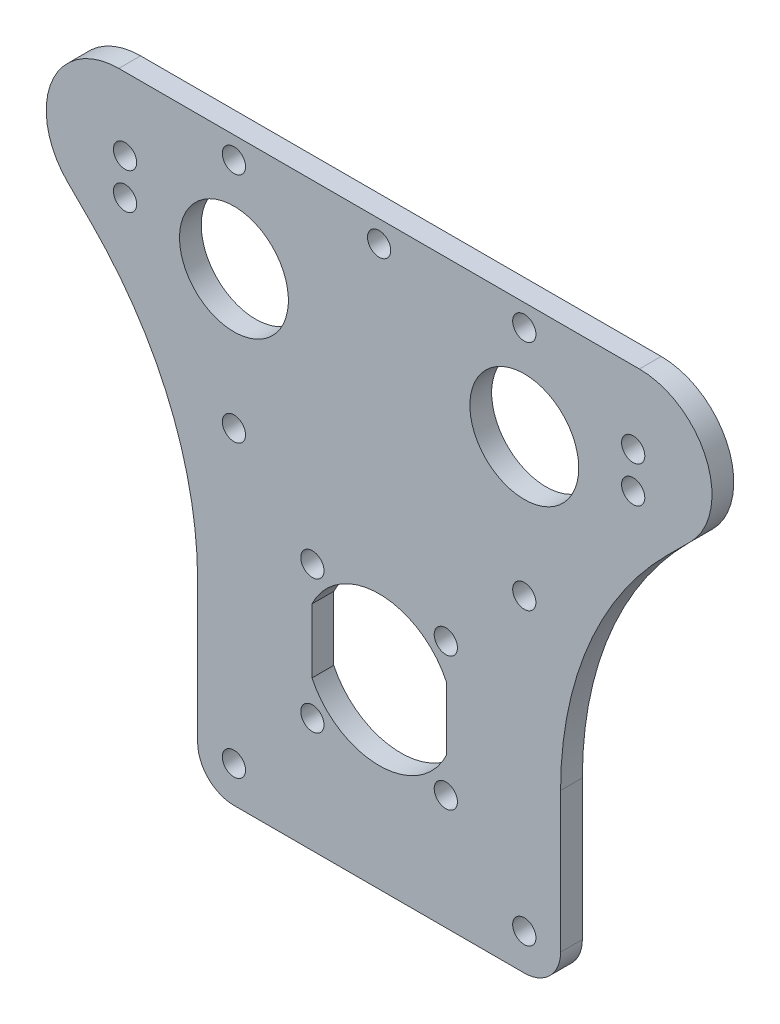
ISO-10303-21;
HEADER;
FILE_DESCRIPTION(('STEP AP214'),'2;1');
FILE_NAME('part.step','',(''),(''),'','','');
FILE_SCHEMA(('AUTOMOTIVE_DESIGN { 1 0 10303 214 1 1 1 1 }'));
ENDSEC;
DATA;
#1=APPLICATION_CONTEXT('core data for automotive mechanical design processes');
#2=APPLICATION_PROTOCOL_DEFINITION('international standard','automotive_design',2000,#1);
#3=PRODUCT_CONTEXT('',#1,'mechanical');
#4=PRODUCT('Part','Part','',(#3));
#5=PRODUCT_RELATED_PRODUCT_CATEGORY('part','',(#4));
#6=PRODUCT_DEFINITION_FORMATION('','',#4);
#7=PRODUCT_DEFINITION_CONTEXT('part definition',#1,'design');
#8=PRODUCT_DEFINITION('design','',#6,#7);
#9=PRODUCT_DEFINITION_SHAPE('','',#8);
#10=(LENGTH_UNIT() NAMED_UNIT(*) SI_UNIT(.MILLI.,.METRE.));
#11=(NAMED_UNIT(*) PLANE_ANGLE_UNIT() SI_UNIT($,.RADIAN.));
#12=(NAMED_UNIT(*) SI_UNIT($,.STERADIAN.) SOLID_ANGLE_UNIT());
#13=UNCERTAINTY_MEASURE_WITH_UNIT(LENGTH_MEASURE(1.E-05),#10,'distance_accuracy_value','');
#14=(GEOMETRIC_REPRESENTATION_CONTEXT(3) GLOBAL_UNCERTAINTY_ASSIGNED_CONTEXT((#13)) GLOBAL_UNIT_ASSIGNED_CONTEXT((#10,
#11,#12)) REPRESENTATION_CONTEXT('',''));
#15=CARTESIAN_POINT('',(0.,0.,0.));
#16=DIRECTION('',(0.,0.,1.));
#17=DIRECTION('',(1.,0.,0.));
#18=AXIS2_PLACEMENT_3D('',#15,#16,#17);
#19=CARTESIAN_POINT('',(0.,0.,3.));
#20=DIRECTION('',(0.,0.,1.));
#21=DIRECTION('',(1.,0.,0.));
#22=AXIS2_PLACEMENT_3D('',#19,#20,#21);
#23=PLANE('',#22);
#24=CARTESIAN_POINT('',(-20.,51.9999999999999,3.));
#25=DIRECTION('',(0.,0.,1.));
#26=DIRECTION('',(1.,0.,0.));
#27=AXIS2_PLACEMENT_3D('',#24,#25,#26);
#28=CIRCLE('',#27,1.6);
#29=CARTESIAN_POINT('',(-18.4,51.9999999999999,3.));
#30=VERTEX_POINT('',#29);
#31=EDGE_CURVE('E749',#30,#30,#28,.T.);
#32=ORIENTED_EDGE('',*,*,#31,.F.);
#33=EDGE_LOOP('',(#32));
#34=FACE_BOUND('',#33,.T.);
#35=CARTESIAN_POINT('',(20.,52.,3.));
#36=DIRECTION('',(0.,0.,1.));
#37=DIRECTION('',(1.,0.,0.));
#38=AXIS2_PLACEMENT_3D('',#35,#36,#37);
#39=CIRCLE('',#38,1.6);
#40=CARTESIAN_POINT('',(21.6,52.,3.));
#41=VERTEX_POINT('',#40);
#42=EDGE_CURVE('E751',#41,#41,#39,.T.);
#43=ORIENTED_EDGE('',*,*,#42,.F.);
#44=EDGE_LOOP('',(#43));
#45=FACE_BOUND('',#44,.T.);
#46=CARTESIAN_POINT('',(0.,52.,3.));
#47=DIRECTION('',(0.,0.,1.));
#48=DIRECTION('',(1.,0.,0.));
#49=AXIS2_PLACEMENT_3D('',#46,#47,#48);
#50=CIRCLE('',#49,1.6);
#51=CARTESIAN_POINT('',(1.6,52.,3.));
#52=VERTEX_POINT('',#51);
#53=EDGE_CURVE('E759',#52,#52,#50,.T.);
#54=ORIENTED_EDGE('',*,*,#53,.F.);
#55=EDGE_LOOP('',(#54));
#56=FACE_BOUND('',#55,.T.);
#57=CARTESIAN_POINT('',(35.,40.,3.));
#58=DIRECTION('',(0.,0.,-1.));
#59=DIRECTION('',(-1.,0.,0.));
#60=AXIS2_PLACEMENT_3D('',#57,#58,#59);
#61=CIRCLE('',#60,1.6);
#62=CARTESIAN_POINT('',(33.4,40.,3.));
#63=VERTEX_POINT('',#62);
#64=EDGE_CURVE('E763',#63,#63,#61,.T.);
#65=ORIENTED_EDGE('',*,*,#64,.T.);
#66=EDGE_LOOP('',(#65));
#67=FACE_BOUND('',#66,.T.);
#68=CARTESIAN_POINT('',(-35.,40.,3.));
#69=DIRECTION('',(0.,0.,-1.));
#70=DIRECTION('',(1.,0.,0.));
#71=AXIS2_PLACEMENT_3D('',#68,#69,#70);
#72=CIRCLE('',#71,1.6);
#73=CARTESIAN_POINT('',(-33.4,40.,3.));
#74=VERTEX_POINT('',#73);
#75=EDGE_CURVE('E770',#74,#74,#72,.T.);
#76=ORIENTED_EDGE('',*,*,#75,.T.);
#77=EDGE_LOOP('',(#76));
#78=FACE_BOUND('',#77,.T.);
#79=CARTESIAN_POINT('',(20.,39.,3.));
#80=DIRECTION('',(0.,0.,1.));
#81=DIRECTION('',(1.,0.,0.));
#82=AXIS2_PLACEMENT_3D('',#79,#80,#81);
#83=CIRCLE('',#82,7.5);
#84=CARTESIAN_POINT('',(27.5,39.,3.));
#85=VERTEX_POINT('',#84);
#86=EDGE_CURVE('E779',#85,#85,#83,.T.);
#87=ORIENTED_EDGE('',*,*,#86,.F.);
#88=EDGE_LOOP('',(#87));
#89=FACE_BOUND('',#88,.T.);
#90=CARTESIAN_POINT('',(-20.,39.,3.));
#91=DIRECTION('',(0.,0.,1.));
#92=DIRECTION('',(-1.,0.,0.));
#93=AXIS2_PLACEMENT_3D('',#90,#91,#92);
#94=CIRCLE('',#93,7.5);
#95=CARTESIAN_POINT('',(-27.5,39.,3.));
#96=VERTEX_POINT('',#95);
#97=EDGE_CURVE('E766',#96,#96,#94,.T.);
#98=ORIENTED_EDGE('',*,*,#97,.F.);
#99=EDGE_LOOP('',(#98));
#100=FACE_BOUND('',#99,.T.);
#101=CARTESIAN_POINT('',(-35.,45.,3.));
#102=DIRECTION('',(0.,0.,1.));
#103=DIRECTION('',(1.,0.,0.));
#104=AXIS2_PLACEMENT_3D('',#101,#102,#103);
#105=CIRCLE('',#104,1.60000000000001);
#106=CARTESIAN_POINT('',(-33.4,45.,3.));
#107=VERTEX_POINT('',#106);
#108=EDGE_CURVE('E789',#107,#107,#105,.T.);
#109=ORIENTED_EDGE('',*,*,#108,.F.);
#110=EDGE_LOOP('',(#109));
#111=FACE_BOUND('',#110,.T.);
#112=CARTESIAN_POINT('',(35.,45.,3.));
#113=DIRECTION('',(0.,0.,1.));
#114=DIRECTION('',(-1.,0.,0.));
#115=AXIS2_PLACEMENT_3D('',#112,#113,#114);
#116=CIRCLE('',#115,1.60000000000001);
#117=CARTESIAN_POINT('',(33.4,45.,3.));
#118=VERTEX_POINT('',#117);
#119=EDGE_CURVE('E778',#118,#118,#116,.T.);
#120=ORIENTED_EDGE('',*,*,#119,.F.);
#121=EDGE_LOOP('',(#120));
#122=FACE_BOUND('',#121,.T.);
#123=DIRECTION('',(0.707106781186544,-0.707106781186551,0.));
#124=VECTOR('',#123,1.);
#125=CARTESIAN_POINT('',(-25.,20.,3.));
#126=LINE('',#125,#124);
#127=CARTESIAN_POINT('',(-42.9289321881344,37.9289321881346,3.));
#128=VERTEX_POINT('',#127);
#129=CARTESIAN_POINT('',(-39.6446609406724,34.6446609406726,3.));
#130=VERTEX_POINT('',#129);
#131=EDGE_CURVE('E157',#128,#130,#126,.T.);
#132=ORIENTED_EDGE('',*,*,#131,.T.);
#133=CARTESIAN_POINT('',(-75.,-0.710678118654585,3.));
#134=DIRECTION('',(0.,0.,1.));
#135=DIRECTION('',(1.,0.,0.));
#136=AXIS2_PLACEMENT_3D('',#133,#134,#135);
#137=CIRCLE('',#136,50.);
#138=CARTESIAN_POINT('',(-25.,-0.710678118654589,3.));
#139=VERTEX_POINT('',#138);
#140=EDGE_CURVE('E326',#130,#139,#137,.F.);
#141=ORIENTED_EDGE('',*,*,#140,.T.);
#142=DIRECTION('',(0.,-1.,0.));
#143=VECTOR('',#142,1.);
#144=CARTESIAN_POINT('',(-25.,25.,3.));
#145=LINE('',#144,#143);
#146=CARTESIAN_POINT('',(-25.,-20.,3.));
#147=VERTEX_POINT('',#146);
#148=EDGE_CURVE('E283',#139,#147,#145,.T.);
#149=ORIENTED_EDGE('',*,*,#148,.T.);
#150=CARTESIAN_POINT('',(-20.,-20.,3.));
#151=DIRECTION('',(0.,0.,1.));
#152=DIRECTION('',(1.,0.,0.));
#153=AXIS2_PLACEMENT_3D('',#150,#151,#152);
#154=CIRCLE('',#153,5.);
#155=CARTESIAN_POINT('',(-20.,-25.,3.));
#156=VERTEX_POINT('',#155);
#157=EDGE_CURVE('E308',#147,#156,#154,.T.);
#158=ORIENTED_EDGE('',*,*,#157,.T.);
#159=DIRECTION('',(1.,0.,0.));
#160=VECTOR('',#159,1.);
#161=CARTESIAN_POINT('',(-25.,-25.,3.));
#162=LINE('',#161,#160);
#163=CARTESIAN_POINT('',(20.,-25.,3.));
#164=VERTEX_POINT('',#163);
#165=EDGE_CURVE('E286',#156,#164,#162,.T.);
#166=ORIENTED_EDGE('',*,*,#165,.T.);
#167=CARTESIAN_POINT('',(20.,-20.,3.));
#168=DIRECTION('',(0.,0.,1.));
#169=DIRECTION('',(1.,0.,0.));
#170=AXIS2_PLACEMENT_3D('',#167,#168,#169);
#171=CIRCLE('',#170,5.);
#172=CARTESIAN_POINT('',(25.,-20.,3.));
#173=VERTEX_POINT('',#172);
#174=EDGE_CURVE('E310',#164,#173,#171,.T.);
#175=ORIENTED_EDGE('',*,*,#174,.T.);
#176=DIRECTION('',(0.,1.,0.));
#177=VECTOR('',#176,1.);
#178=CARTESIAN_POINT('',(25.,25.,3.));
#179=LINE('',#178,#177);
#180=CARTESIAN_POINT('',(25.,-0.710678118654592,3.));
#181=VERTEX_POINT('',#180);
#182=EDGE_CURVE('E281',#173,#181,#179,.T.);
#183=ORIENTED_EDGE('',*,*,#182,.T.);
#184=CARTESIAN_POINT('',(75.,-0.710678118654575,3.));
#185=DIRECTION('',(0.,0.,1.));
#186=DIRECTION('',(1.,0.,0.));
#187=AXIS2_PLACEMENT_3D('',#184,#185,#186);
#188=CIRCLE('',#187,50.);
#189=CARTESIAN_POINT('',(39.6446609406724,34.6446609406726,3.));
#190=VERTEX_POINT('',#189);
#191=EDGE_CURVE('E47',#181,#190,#188,.F.);
#192=ORIENTED_EDGE('',*,*,#191,.T.);
#193=DIRECTION('',(0.707106781186543,0.707106781186552,0.));
#194=VECTOR('',#193,1.);
#195=CARTESIAN_POINT('',(42.9289321881343,37.9289321881346,3.));
#196=LINE('',#195,#194);
#197=CARTESIAN_POINT('',(42.9289321881344,37.9289321881346,3.));
#198=VERTEX_POINT('',#197);
#199=EDGE_CURVE('E183',#190,#198,#196,.T.);
#200=ORIENTED_EDGE('',*,*,#199,.T.);
#201=CARTESIAN_POINT('',(35.8578643762688,45.,3.));
#202=DIRECTION('',(0.,0.,1.));
#203=DIRECTION('',(-1.,0.,0.));
#204=AXIS2_PLACEMENT_3D('',#201,#202,#203);
#205=CIRCLE('',#204,10.);
#206=CARTESIAN_POINT('',(35.8578643762688,55.,3.));
#207=VERTEX_POINT('',#206);
#208=EDGE_CURVE('E163',#198,#207,#205,.T.);
#209=ORIENTED_EDGE('',*,*,#208,.T.);
#210=DIRECTION('',(-1.,0.,0.));
#211=VECTOR('',#210,1.);
#212=CARTESIAN_POINT('',(-35.8578643762689,55.,3.));
#213=LINE('',#212,#211);
#214=CARTESIAN_POINT('',(-35.8578643762689,55.,3.));
#215=VERTEX_POINT('',#214);
#216=EDGE_CURVE('E187',#207,#215,#213,.T.);
#217=ORIENTED_EDGE('',*,*,#216,.T.);
#218=CARTESIAN_POINT('',(-35.8578643762689,45.,3.));
#219=DIRECTION('',(0.,0.,1.));
#220=DIRECTION('',(-1.,0.,0.));
#221=AXIS2_PLACEMENT_3D('',#218,#219,#220);
#222=CIRCLE('',#221,10.);
#223=EDGE_CURVE('E190',#215,#128,#222,.T.);
#224=ORIENTED_EDGE('',*,*,#223,.T.);
#225=EDGE_LOOP('',(#132,#141,#149,#158,#166,#175,#183,#192,#200,#209,#217,#224));
#226=FACE_BOUND('',#225,.T.);
#227=CARTESIAN_POINT('',(0.,0.,3.));
#228=DIRECTION('',(0.,0.,1.));
#229=DIRECTION('',(1.,0.,0.));
#230=AXIS2_PLACEMENT_3D('',#227,#228,#229);
#231=CIRCLE('',#230,10.25);
#232=CARTESIAN_POINT('',(9.25,4.41588043316393,3.));
#233=VERTEX_POINT('',#232);
#234=CARTESIAN_POINT('',(-9.25,4.41588043316393,3.));
#235=VERTEX_POINT('',#234);
#236=EDGE_CURVE('E197',#233,#235,#231,.T.);
#237=ORIENTED_EDGE('',*,*,#236,.F.);
#238=DIRECTION('',(0.,1.,0.));
#239=VECTOR('',#238,1.);
#240=CARTESIAN_POINT('',(9.25,-4.41588043316393,3.));
#241=LINE('',#240,#239);
#242=CARTESIAN_POINT('',(9.25,-4.41588043316393,3.));
#243=VERTEX_POINT('',#242);
#244=EDGE_CURVE('E205',#243,#233,#241,.T.);
#245=ORIENTED_EDGE('',*,*,#244,.F.);
#246=CARTESIAN_POINT('',(0.,0.,3.));
#247=DIRECTION('',(0.,0.,1.));
#248=DIRECTION('',(1.,0.,0.));
#249=AXIS2_PLACEMENT_3D('',#246,#247,#248);
#250=CIRCLE('',#249,10.25);
#251=CARTESIAN_POINT('',(-9.25,-4.41588043316393,3.));
#252=VERTEX_POINT('',#251);
#253=EDGE_CURVE('E219',#252,#243,#250,.T.);
#254=ORIENTED_EDGE('',*,*,#253,.F.);
#255=DIRECTION('',(0.,-1.,0.));
#256=VECTOR('',#255,1.);
#257=CARTESIAN_POINT('',(-9.25,4.41588043316393,3.));
#258=LINE('',#257,#256);
#259=EDGE_CURVE('E216',#235,#252,#258,.T.);
#260=ORIENTED_EDGE('',*,*,#259,.F.);
#261=EDGE_LOOP('',(#237,#245,#254,#260));
#262=FACE_BOUND('',#261,.T.);
#263=CARTESIAN_POINT('',(-20.,-20.,3.));
#264=DIRECTION('',(0.,0.,1.));
#265=DIRECTION('',(1.,0.,0.));
#266=AXIS2_PLACEMENT_3D('',#263,#264,#265);
#267=CIRCLE('',#266,1.60000000000048);
#268=CARTESIAN_POINT('',(-18.3999999999995,-20.,3.));
#269=VERTEX_POINT('',#268);
#270=EDGE_CURVE('E239',#269,#269,#267,.T.);
#271=ORIENTED_EDGE('',*,*,#270,.F.);
#272=EDGE_LOOP('',(#271));
#273=FACE_BOUND('',#272,.T.);
#274=CARTESIAN_POINT('',(20.,-20.,3.));
#275=DIRECTION('',(0.,0.,1.));
#276=DIRECTION('',(1.,0.,0.));
#277=AXIS2_PLACEMENT_3D('',#274,#275,#276);
#278=CIRCLE('',#277,1.60000000000064);
#279=CARTESIAN_POINT('',(21.6000000000006,-20.,3.));
#280=VERTEX_POINT('',#279);
#281=EDGE_CURVE('E251',#280,#280,#278,.T.);
#282=ORIENTED_EDGE('',*,*,#281,.F.);
#283=EDGE_LOOP('',(#282));
#284=FACE_BOUND('',#283,.T.);
#285=CARTESIAN_POINT('',(20.,20.,3.));
#286=DIRECTION('',(0.,0.,1.));
#287=DIRECTION('',(1.,0.,0.));
#288=AXIS2_PLACEMENT_3D('',#285,#286,#287);
#289=CIRCLE('',#288,1.60000000000016);
#290=CARTESIAN_POINT('',(21.6000000000002,20.,3.));
#291=VERTEX_POINT('',#290);
#292=EDGE_CURVE('E263',#291,#291,#289,.T.);
#293=ORIENTED_EDGE('',*,*,#292,.F.);
#294=EDGE_LOOP('',(#293));
#295=FACE_BOUND('',#294,.T.);
#296=CARTESIAN_POINT('',(-20.,20.,3.));
#297=DIRECTION('',(0.,0.,1.));
#298=DIRECTION('',(1.,0.,0.));
#299=AXIS2_PLACEMENT_3D('',#296,#297,#298);
#300=CIRCLE('',#299,1.6);
#301=CARTESIAN_POINT('',(-18.4,20.,3.));
#302=VERTEX_POINT('',#301);
#303=EDGE_CURVE('E275',#302,#302,#300,.T.);
#304=ORIENTED_EDGE('',*,*,#303,.F.);
#305=EDGE_LOOP('',(#304));
#306=FACE_BOUND('',#305,.T.);
#307=CARTESIAN_POINT('',(-9.19238815542511,9.19238815542512,3.));
#308=DIRECTION('',(0.,0.,1.));
#309=DIRECTION('',(1.,0.,0.));
#310=AXIS2_PLACEMENT_3D('',#307,#308,#309);
#311=CIRCLE('',#310,1.6);
#312=CARTESIAN_POINT('',(-7.59238815542511,9.19238815542512,3.));
#313=VERTEX_POINT('',#312);
#314=EDGE_CURVE('E269',#313,#313,#311,.T.);
#315=ORIENTED_EDGE('',*,*,#314,.F.);
#316=EDGE_LOOP('',(#315));
#317=FACE_BOUND('',#316,.T.);
#318=CARTESIAN_POINT('',(9.19238815542512,9.19238815542512,3.));
#319=DIRECTION('',(0.,0.,1.));
#320=DIRECTION('',(1.,0.,0.));
#321=AXIS2_PLACEMENT_3D('',#318,#319,#320);
#322=CIRCLE('',#321,1.60000000000015);
#323=CARTESIAN_POINT('',(10.7923881554253,9.19238815542512,3.));
#324=VERTEX_POINT('',#323);
#325=EDGE_CURVE('E257',#324,#324,#322,.T.);
#326=ORIENTED_EDGE('',*,*,#325,.F.);
#327=EDGE_LOOP('',(#326));
#328=FACE_BOUND('',#327,.T.);
#329=CARTESIAN_POINT('',(9.19238815542512,-9.19238815542511,3.));
#330=DIRECTION('',(0.,0.,1.));
#331=DIRECTION('',(1.,0.,0.));
#332=AXIS2_PLACEMENT_3D('',#329,#330,#331);
#333=CIRCLE('',#332,1.60000000000064);
#334=CARTESIAN_POINT('',(10.7923881554258,-9.19238815542511,3.));
#335=VERTEX_POINT('',#334);
#336=EDGE_CURVE('E245',#335,#335,#333,.T.);
#337=ORIENTED_EDGE('',*,*,#336,.F.);
#338=EDGE_LOOP('',(#337));
#339=FACE_BOUND('',#338,.T.);
#340=CARTESIAN_POINT('',(-9.19238815542512,-9.19238815542512,3.));
#341=DIRECTION('',(0.,0.,1.));
#342=DIRECTION('',(1.,0.,0.));
#343=AXIS2_PLACEMENT_3D('',#340,#341,#342);
#344=CIRCLE('',#343,1.60000000000049);
#345=CARTESIAN_POINT('',(-7.59238815542463,-9.19238815542512,3.));
#346=VERTEX_POINT('',#345);
#347=EDGE_CURVE('E233',#346,#346,#344,.T.);
#348=ORIENTED_EDGE('',*,*,#347,.F.);
#349=EDGE_LOOP('',(#348));
#350=FACE_BOUND('',#349,.T.);
#351=ADVANCED_FACE('F39',(#34,#45,#56,#67,#78,#89,#100,#111,#122,#226,#262,#273,#284,#295,#306,
#317,#328,#339,#350),#23,.T.);
#352=CARTESIAN_POINT('',(0.,0.,0.));
#353=DIRECTION('',(0.,0.,1.));
#354=DIRECTION('',(1.,0.,0.));
#355=AXIS2_PLACEMENT_3D('',#352,#353,#354);
#356=PLANE('',#355);
#357=CARTESIAN_POINT('',(-20.,51.9999999999999,0.));
#358=DIRECTION('',(0.,0.,1.));
#359=DIRECTION('',(1.,0.,0.));
#360=AXIS2_PLACEMENT_3D('',#357,#358,#359);
#361=CIRCLE('',#360,1.6);
#362=CARTESIAN_POINT('',(-18.4,51.9999999999999,0.));
#363=VERTEX_POINT('',#362);
#364=EDGE_CURVE('E747',#363,#363,#361,.T.);
#365=ORIENTED_EDGE('',*,*,#364,.T.);
#366=EDGE_LOOP('',(#365));
#367=FACE_BOUND('',#366,.T.);
#368=CARTESIAN_POINT('',(20.,52.,0.));
#369=DIRECTION('',(0.,0.,1.));
#370=DIRECTION('',(1.,0.,0.));
#371=AXIS2_PLACEMENT_3D('',#368,#369,#370);
#372=CIRCLE('',#371,1.6);
#373=CARTESIAN_POINT('',(21.6,52.,0.));
#374=VERTEX_POINT('',#373);
#375=EDGE_CURVE('E762',#374,#374,#372,.T.);
#376=ORIENTED_EDGE('',*,*,#375,.T.);
#377=EDGE_LOOP('',(#376));
#378=FACE_BOUND('',#377,.T.);
#379=CARTESIAN_POINT('',(0.,52.,0.));
#380=DIRECTION('',(0.,0.,1.));
#381=DIRECTION('',(1.,0.,0.));
#382=AXIS2_PLACEMENT_3D('',#379,#380,#381);
#383=CIRCLE('',#382,1.6);
#384=CARTESIAN_POINT('',(1.6,52.,0.));
#385=VERTEX_POINT('',#384);
#386=EDGE_CURVE('E755',#385,#385,#383,.T.);
#387=ORIENTED_EDGE('',*,*,#386,.T.);
#388=EDGE_LOOP('',(#387));
#389=FACE_BOUND('',#388,.T.);
#390=CARTESIAN_POINT('',(35.,40.,0.));
#391=DIRECTION('',(0.,0.,-1.));
#392=DIRECTION('',(-1.,0.,0.));
#393=AXIS2_PLACEMENT_3D('',#390,#391,#392);
#394=CIRCLE('',#393,1.6);
#395=CARTESIAN_POINT('',(33.4,40.,0.));
#396=VERTEX_POINT('',#395);
#397=EDGE_CURVE('E767',#396,#396,#394,.T.);
#398=ORIENTED_EDGE('',*,*,#397,.F.);
#399=EDGE_LOOP('',(#398));
#400=FACE_BOUND('',#399,.T.);
#401=CARTESIAN_POINT('',(-35.,40.,0.));
#402=DIRECTION('',(0.,0.,-1.));
#403=DIRECTION('',(1.,0.,0.));
#404=AXIS2_PLACEMENT_3D('',#401,#402,#403);
#405=CIRCLE('',#404,1.6);
#406=CARTESIAN_POINT('',(-33.4,40.,0.));
#407=VERTEX_POINT('',#406);
#408=EDGE_CURVE('E758',#407,#407,#405,.T.);
#409=ORIENTED_EDGE('',*,*,#408,.F.);
#410=EDGE_LOOP('',(#409));
#411=FACE_BOUND('',#410,.T.);
#412=CARTESIAN_POINT('',(20.,39.,0.));
#413=DIRECTION('',(0.,0.,1.));
#414=DIRECTION('',(1.,0.,0.));
#415=AXIS2_PLACEMENT_3D('',#412,#413,#414);
#416=CIRCLE('',#415,7.5);
#417=CARTESIAN_POINT('',(27.5,39.,0.));
#418=VERTEX_POINT('',#417);
#419=EDGE_CURVE('E775',#418,#418,#416,.T.);
#420=ORIENTED_EDGE('',*,*,#419,.T.);
#421=EDGE_LOOP('',(#420));
#422=FACE_BOUND('',#421,.T.);
#423=CARTESIAN_POINT('',(-20.,39.,0.));
#424=DIRECTION('',(0.,0.,1.));
#425=DIRECTION('',(-1.,0.,0.));
#426=AXIS2_PLACEMENT_3D('',#423,#424,#425);
#427=CIRCLE('',#426,7.5);
#428=CARTESIAN_POINT('',(-27.5,39.,0.));
#429=VERTEX_POINT('',#428);
#430=EDGE_CURVE('E782',#429,#429,#427,.T.);
#431=ORIENTED_EDGE('',*,*,#430,.T.);
#432=EDGE_LOOP('',(#431));
#433=FACE_BOUND('',#432,.T.);
#434=CARTESIAN_POINT('',(-35.,45.,0.));
#435=DIRECTION('',(0.,0.,1.));
#436=DIRECTION('',(1.,0.,0.));
#437=AXIS2_PLACEMENT_3D('',#434,#435,#436);
#438=CIRCLE('',#437,1.60000000000001);
#439=CARTESIAN_POINT('',(-33.4,45.,0.));
#440=VERTEX_POINT('',#439);
#441=EDGE_CURVE('E185',#440,#440,#438,.T.);
#442=ORIENTED_EDGE('',*,*,#441,.T.);
#443=EDGE_LOOP('',(#442));
#444=FACE_BOUND('',#443,.T.);
#445=CARTESIAN_POINT('',(35.,45.,0.));
#446=DIRECTION('',(0.,0.,1.));
#447=DIRECTION('',(-1.,0.,0.));
#448=AXIS2_PLACEMENT_3D('',#445,#446,#447);
#449=CIRCLE('',#448,1.60000000000001);
#450=CARTESIAN_POINT('',(33.4,45.,0.));
#451=VERTEX_POINT('',#450);
#452=EDGE_CURVE('E792',#451,#451,#449,.T.);
#453=ORIENTED_EDGE('',*,*,#452,.T.);
#454=EDGE_LOOP('',(#453));
#455=FACE_BOUND('',#454,.T.);
#456=DIRECTION('',(0.,1.,0.));
#457=VECTOR('',#456,1.);
#458=CARTESIAN_POINT('',(9.25,-4.41588043316393,0.));
#459=LINE('',#458,#457);
#460=CARTESIAN_POINT('',(9.25,-4.41588043316393,0.));
#461=VERTEX_POINT('',#460);
#462=CARTESIAN_POINT('',(9.25,4.41588043316393,0.));
#463=VERTEX_POINT('',#462);
#464=EDGE_CURVE('E211',#461,#463,#459,.T.);
#465=ORIENTED_EDGE('',*,*,#464,.T.);
#466=CARTESIAN_POINT('',(0.,0.,0.));
#467=DIRECTION('',(0.,0.,1.));
#468=DIRECTION('',(1.,0.,0.));
#469=AXIS2_PLACEMENT_3D('',#466,#467,#468);
#470=CIRCLE('',#469,10.25);
#471=CARTESIAN_POINT('',(-9.25,4.41588043316393,0.));
#472=VERTEX_POINT('',#471);
#473=EDGE_CURVE('E201',#463,#472,#470,.T.);
#474=ORIENTED_EDGE('',*,*,#473,.T.);
#475=DIRECTION('',(0.,-1.,0.));
#476=VECTOR('',#475,1.);
#477=CARTESIAN_POINT('',(-9.25,4.41588043316393,0.));
#478=LINE('',#477,#476);
#479=CARTESIAN_POINT('',(-9.25,-4.41588043316393,0.));
#480=VERTEX_POINT('',#479);
#481=EDGE_CURVE('E204',#472,#480,#478,.T.);
#482=ORIENTED_EDGE('',*,*,#481,.T.);
#483=CARTESIAN_POINT('',(0.,0.,0.));
#484=DIRECTION('',(0.,0.,1.));
#485=DIRECTION('',(1.,0.,0.));
#486=AXIS2_PLACEMENT_3D('',#483,#484,#485);
#487=CIRCLE('',#486,10.25);
#488=EDGE_CURVE('E208',#480,#461,#487,.T.);
#489=ORIENTED_EDGE('',*,*,#488,.T.);
#490=EDGE_LOOP('',(#465,#474,#482,#489));
#491=FACE_BOUND('',#490,.T.);
#492=DIRECTION('',(0.,1.,0.));
#493=VECTOR('',#492,1.);
#494=CARTESIAN_POINT('',(25.,25.,0.));
#495=LINE('',#494,#493);
#496=CARTESIAN_POINT('',(25.,-20.,0.));
#497=VERTEX_POINT('',#496);
#498=CARTESIAN_POINT('',(25.,-0.710678118654592,0.));
#499=VERTEX_POINT('',#498);
#500=EDGE_CURVE('E278',#497,#499,#495,.T.);
#501=ORIENTED_EDGE('',*,*,#500,.F.);
#502=CARTESIAN_POINT('',(20.,-20.,0.));
#503=DIRECTION('',(0.,0.,1.));
#504=DIRECTION('',(1.,0.,0.));
#505=AXIS2_PLACEMENT_3D('',#502,#503,#504);
#506=CIRCLE('',#505,5.);
#507=CARTESIAN_POINT('',(20.,-25.,0.));
#508=VERTEX_POINT('',#507);
#509=EDGE_CURVE('E301',#497,#508,#506,.F.);
#510=ORIENTED_EDGE('',*,*,#509,.T.);
#511=DIRECTION('',(1.,0.,0.));
#512=VECTOR('',#511,1.);
#513=CARTESIAN_POINT('',(-25.,-25.,0.));
#514=LINE('',#513,#512);
#515=CARTESIAN_POINT('',(-20.,-25.,0.));
#516=VERTEX_POINT('',#515);
#517=EDGE_CURVE('E284',#516,#508,#514,.T.);
#518=ORIENTED_EDGE('',*,*,#517,.F.);
#519=CARTESIAN_POINT('',(-20.,-20.,0.));
#520=DIRECTION('',(0.,0.,1.));
#521=DIRECTION('',(1.,0.,0.));
#522=AXIS2_PLACEMENT_3D('',#519,#520,#521);
#523=CIRCLE('',#522,5.);
#524=CARTESIAN_POINT('',(-25.,-20.,0.));
#525=VERTEX_POINT('',#524);
#526=EDGE_CURVE('E298',#516,#525,#523,.F.);
#527=ORIENTED_EDGE('',*,*,#526,.T.);
#528=DIRECTION('',(0.,-1.,0.));
#529=VECTOR('',#528,1.);
#530=CARTESIAN_POINT('',(-25.,25.,0.));
#531=LINE('',#530,#529);
#532=CARTESIAN_POINT('',(-25.,-0.710678118654589,0.));
#533=VERTEX_POINT('',#532);
#534=EDGE_CURVE('E292',#533,#525,#531,.T.);
#535=ORIENTED_EDGE('',*,*,#534,.F.);
#536=CARTESIAN_POINT('',(-75.,-0.710678118654585,0.));
#537=DIRECTION('',(0.,0.,1.));
#538=DIRECTION('',(1.,0.,0.));
#539=AXIS2_PLACEMENT_3D('',#536,#537,#538);
#540=CIRCLE('',#539,50.);
#541=CARTESIAN_POINT('',(-39.6446609406724,34.6446609406726,0.));
#542=VERTEX_POINT('',#541);
#543=EDGE_CURVE('E324',#533,#542,#540,.T.);
#544=ORIENTED_EDGE('',*,*,#543,.T.);
#545=DIRECTION('',(0.707106781186544,-0.707106781186551,0.));
#546=VECTOR('',#545,1.);
#547=CARTESIAN_POINT('',(-25.,20.,0.));
#548=LINE('',#547,#546);
#549=CARTESIAN_POINT('',(-42.9289321881344,37.9289321881346,0.));
#550=VERTEX_POINT('',#549);
#551=EDGE_CURVE('E165',#550,#542,#548,.T.);
#552=ORIENTED_EDGE('',*,*,#551,.F.);
#553=CARTESIAN_POINT('',(-35.8578643762689,45.,0.));
#554=DIRECTION('',(0.,0.,1.));
#555=DIRECTION('',(-1.,0.,0.));
#556=AXIS2_PLACEMENT_3D('',#553,#554,#555);
#557=CIRCLE('',#556,10.);
#558=CARTESIAN_POINT('',(-35.8578643762689,55.,0.));
#559=VERTEX_POINT('',#558);
#560=EDGE_CURVE('E175',#559,#550,#557,.T.);
#561=ORIENTED_EDGE('',*,*,#560,.F.);
#562=DIRECTION('',(-1.,0.,0.));
#563=VECTOR('',#562,1.);
#564=CARTESIAN_POINT('',(-35.8578643762689,55.,0.));
#565=LINE('',#564,#563);
#566=CARTESIAN_POINT('',(35.8578643762688,55.,0.));
#567=VERTEX_POINT('',#566);
#568=EDGE_CURVE('E173',#567,#559,#565,.T.);
#569=ORIENTED_EDGE('',*,*,#568,.F.);
#570=CARTESIAN_POINT('',(35.8578643762688,45.,0.));
#571=DIRECTION('',(0.,0.,1.));
#572=DIRECTION('',(-1.,0.,0.));
#573=AXIS2_PLACEMENT_3D('',#570,#571,#572);
#574=CIRCLE('',#573,10.);
#575=CARTESIAN_POINT('',(42.9289321881344,37.9289321881346,0.));
#576=VERTEX_POINT('',#575);
#577=EDGE_CURVE('E156',#576,#567,#574,.T.);
#578=ORIENTED_EDGE('',*,*,#577,.F.);
#579=DIRECTION('',(0.707106781186543,0.707106781186552,0.));
#580=VECTOR('',#579,1.);
#581=CARTESIAN_POINT('',(42.9289321881343,37.9289321881346,0.));
#582=LINE('',#581,#580);
#583=CARTESIAN_POINT('',(39.6446609406724,34.6446609406726,0.));
#584=VERTEX_POINT('',#583);
#585=EDGE_CURVE('E148',#584,#576,#582,.T.);
#586=ORIENTED_EDGE('',*,*,#585,.F.);
#587=CARTESIAN_POINT('',(75.,-0.710678118654575,0.));
#588=DIRECTION('',(0.,0.,1.));
#589=DIRECTION('',(1.,0.,0.));
#590=AXIS2_PLACEMENT_3D('',#587,#588,#589);
#591=CIRCLE('',#590,50.);
#592=EDGE_CURVE('E11',#584,#499,#591,.T.);
#593=ORIENTED_EDGE('',*,*,#592,.T.);
#594=EDGE_LOOP('',(#501,#510,#518,#527,#535,#544,#552,#561,#569,#578,#586,#593));
#595=FACE_BOUND('',#594,.T.);
#596=CARTESIAN_POINT('',(-20.,20.,0.));
#597=DIRECTION('',(0.,0.,1.));
#598=DIRECTION('',(1.,0.,0.));
#599=AXIS2_PLACEMENT_3D('',#596,#597,#598);
#600=CIRCLE('',#599,1.6);
#601=CARTESIAN_POINT('',(-18.4,20.,0.));
#602=VERTEX_POINT('',#601);
#603=EDGE_CURVE('E272',#602,#602,#600,.T.);
#604=ORIENTED_EDGE('',*,*,#603,.T.);
#605=EDGE_LOOP('',(#604));
#606=FACE_BOUND('',#605,.T.);
#607=CARTESIAN_POINT('',(-9.19238815542511,9.19238815542512,0.));
#608=DIRECTION('',(0.,0.,1.));
#609=DIRECTION('',(1.,0.,0.));
#610=AXIS2_PLACEMENT_3D('',#607,#608,#609);
#611=CIRCLE('',#610,1.6);
#612=CARTESIAN_POINT('',(-7.59238815542511,9.19238815542512,0.));
#613=VERTEX_POINT('',#612);
#614=EDGE_CURVE('E266',#613,#613,#611,.T.);
#615=ORIENTED_EDGE('',*,*,#614,.T.);
#616=EDGE_LOOP('',(#615));
#617=FACE_BOUND('',#616,.T.);
#618=CARTESIAN_POINT('',(20.,20.,0.));
#619=DIRECTION('',(0.,0.,1.));
#620=DIRECTION('',(1.,0.,0.));
#621=AXIS2_PLACEMENT_3D('',#618,#619,#620);
#622=CIRCLE('',#621,1.60000000000016);
#623=CARTESIAN_POINT('',(21.6000000000002,20.,0.));
#624=VERTEX_POINT('',#623);
#625=EDGE_CURVE('E260',#624,#624,#622,.T.);
#626=ORIENTED_EDGE('',*,*,#625,.T.);
#627=EDGE_LOOP('',(#626));
#628=FACE_BOUND('',#627,.T.);
#629=CARTESIAN_POINT('',(9.19238815542512,9.19238815542512,0.));
#630=DIRECTION('',(0.,0.,1.));
#631=DIRECTION('',(1.,0.,0.));
#632=AXIS2_PLACEMENT_3D('',#629,#630,#631);
#633=CIRCLE('',#632,1.60000000000015);
#634=CARTESIAN_POINT('',(10.7923881554253,9.19238815542512,0.));
#635=VERTEX_POINT('',#634);
#636=EDGE_CURVE('E254',#635,#635,#633,.T.);
#637=ORIENTED_EDGE('',*,*,#636,.T.);
#638=EDGE_LOOP('',(#637));
#639=FACE_BOUND('',#638,.T.);
#640=CARTESIAN_POINT('',(20.,-20.,0.));
#641=DIRECTION('',(0.,0.,1.));
#642=DIRECTION('',(1.,0.,0.));
#643=AXIS2_PLACEMENT_3D('',#640,#641,#642);
#644=CIRCLE('',#643,1.60000000000064);
#645=CARTESIAN_POINT('',(21.6000000000006,-20.,0.));
#646=VERTEX_POINT('',#645);
#647=EDGE_CURVE('E248',#646,#646,#644,.T.);
#648=ORIENTED_EDGE('',*,*,#647,.T.);
#649=EDGE_LOOP('',(#648));
#650=FACE_BOUND('',#649,.T.);
#651=CARTESIAN_POINT('',(9.19238815542512,-9.19238815542511,0.));
#652=DIRECTION('',(0.,0.,1.));
#653=DIRECTION('',(1.,0.,0.));
#654=AXIS2_PLACEMENT_3D('',#651,#652,#653);
#655=CIRCLE('',#654,1.60000000000064);
#656=CARTESIAN_POINT('',(10.7923881554258,-9.19238815542511,0.));
#657=VERTEX_POINT('',#656);
#658=EDGE_CURVE('E242',#657,#657,#655,.T.);
#659=ORIENTED_EDGE('',*,*,#658,.T.);
#660=EDGE_LOOP('',(#659));
#661=FACE_BOUND('',#660,.T.);
#662=CARTESIAN_POINT('',(-20.,-20.,0.));
#663=DIRECTION('',(0.,0.,1.));
#664=DIRECTION('',(1.,0.,0.));
#665=AXIS2_PLACEMENT_3D('',#662,#663,#664);
#666=CIRCLE('',#665,1.60000000000048);
#667=CARTESIAN_POINT('',(-18.3999999999995,-20.,0.));
#668=VERTEX_POINT('',#667);
#669=EDGE_CURVE('E236',#668,#668,#666,.T.);
#670=ORIENTED_EDGE('',*,*,#669,.T.);
#671=EDGE_LOOP('',(#670));
#672=FACE_BOUND('',#671,.T.);
#673=CARTESIAN_POINT('',(-9.19238815542512,-9.19238815542512,0.));
#674=DIRECTION('',(0.,0.,1.));
#675=DIRECTION('',(1.,0.,0.));
#676=AXIS2_PLACEMENT_3D('',#673,#674,#675);
#677=CIRCLE('',#676,1.60000000000049);
#678=CARTESIAN_POINT('',(-7.59238815542463,-9.19238815542512,0.));
#679=VERTEX_POINT('',#678);
#680=EDGE_CURVE('E226',#679,#679,#677,.T.);
#681=ORIENTED_EDGE('',*,*,#680,.T.);
#682=EDGE_LOOP('',(#681));
#683=FACE_BOUND('',#682,.T.);
#684=ADVANCED_FACE('F169',(#367,#378,#389,#400,#411,#422,#433,#444,#455,#491,#595,#606,#617,
#628,#639,#650,#661,#672,#683),#356,.F.);
#685=CARTESIAN_POINT('',(25.,25.,3.));
#686=DIRECTION('',(-1.,0.,0.));
#687=DIRECTION('',(0.,-1.,0.));
#688=AXIS2_PLACEMENT_3D('',#685,#686,#687);
#689=PLANE('',#688);
#690=ORIENTED_EDGE('',*,*,#500,.T.);
#691=DIRECTION('',(0.,0.,1.));
#692=VECTOR('',#691,1.);
#693=CARTESIAN_POINT('',(25.,-0.710678118654592,3.));
#694=LINE('',#693,#692);
#695=EDGE_CURVE('E320',#499,#181,#694,.T.);
#696=ORIENTED_EDGE('',*,*,#695,.T.);
#697=ORIENTED_EDGE('',*,*,#182,.F.);
#698=DIRECTION('',(0.,0.,-1.));
#699=VECTOR('',#698,1.);
#700=CARTESIAN_POINT('',(25.,-20.,3.));
#701=LINE('',#700,#699);
#702=EDGE_CURVE('E289',#173,#497,#701,.T.);
#703=ORIENTED_EDGE('',*,*,#702,.T.);
#704=EDGE_LOOP('',(#690,#696,#697,#703));
#705=FACE_BOUND('',#704,.T.);
#706=ADVANCED_FACE('F352',(#705),#689,.F.);
#707=CARTESIAN_POINT('',(-25.,25.,3.));
#708=DIRECTION('',(1.,0.,0.));
#709=DIRECTION('',(0.,1.,0.));
#710=AXIS2_PLACEMENT_3D('',#707,#708,#709);
#711=PLANE('',#710);
#712=ORIENTED_EDGE('',*,*,#148,.F.);
#713=DIRECTION('',(0.,0.,-1.));
#714=VECTOR('',#713,1.);
#715=CARTESIAN_POINT('',(-25.,-0.710678118654589,3.));
#716=LINE('',#715,#714);
#717=EDGE_CURVE('E315',#139,#533,#716,.T.);
#718=ORIENTED_EDGE('',*,*,#717,.T.);
#719=ORIENTED_EDGE('',*,*,#534,.T.);
#720=DIRECTION('',(0.,0.,-1.));
#721=VECTOR('',#720,1.);
#722=CARTESIAN_POINT('',(-25.,-20.,3.));
#723=LINE('',#722,#721);
#724=EDGE_CURVE('E312',#525,#147,#723,.F.);
#725=ORIENTED_EDGE('',*,*,#724,.T.);
#726=EDGE_LOOP('',(#712,#718,#719,#725));
#727=FACE_BOUND('',#726,.T.);
#728=ADVANCED_FACE('F335',(#727),#711,.F.);
#729=CARTESIAN_POINT('',(-25.,-25.,3.));
#730=DIRECTION('',(0.,1.,0.));
#731=DIRECTION('',(-1.,0.,0.));
#732=AXIS2_PLACEMENT_3D('',#729,#730,#731);
#733=PLANE('',#732);
#734=ORIENTED_EDGE('',*,*,#517,.T.);
#735=DIRECTION('',(0.,0.,-1.));
#736=VECTOR('',#735,1.);
#737=CARTESIAN_POINT('',(20.,-25.,3.));
#738=LINE('',#737,#736);
#739=EDGE_CURVE('E306',#508,#164,#738,.F.);
#740=ORIENTED_EDGE('',*,*,#739,.T.);
#741=ORIENTED_EDGE('',*,*,#165,.F.);
#742=DIRECTION('',(0.,0.,-1.));
#743=VECTOR('',#742,1.);
#744=CARTESIAN_POINT('',(-20.,-25.,3.));
#745=LINE('',#744,#743);
#746=EDGE_CURVE('E303',#156,#516,#745,.T.);
#747=ORIENTED_EDGE('',*,*,#746,.T.);
#748=EDGE_LOOP('',(#734,#740,#741,#747));
#749=FACE_BOUND('',#748,.T.);
#750=ADVANCED_FACE('F361',(#749),#733,.F.);
#751=CARTESIAN_POINT('',(-20.,20.,3.));
#752=DIRECTION('',(0.,0.,-1.));
#753=DIRECTION('',(-1.,0.,0.));
#754=AXIS2_PLACEMENT_3D('',#751,#752,#753);
#755=CYLINDRICAL_SURFACE('',#754,1.6);
#756=ORIENTED_EDGE('',*,*,#303,.T.);
#757=EDGE_LOOP('',(#756));
#758=FACE_BOUND('',#757,.T.);
#759=ORIENTED_EDGE('',*,*,#603,.F.);
#760=EDGE_LOOP('',(#759));
#761=FACE_BOUND('',#760,.T.);
#762=ADVANCED_FACE('F390',(#758,#761),#755,.F.);
#763=CARTESIAN_POINT('',(-9.19238815542511,9.19238815542512,3.));
#764=DIRECTION('',(0.,0.,-1.));
#765=DIRECTION('',(-1.,0.,0.));
#766=AXIS2_PLACEMENT_3D('',#763,#764,#765);
#767=CYLINDRICAL_SURFACE('',#766,1.6);
#768=ORIENTED_EDGE('',*,*,#314,.T.);
#769=EDGE_LOOP('',(#768));
#770=FACE_BOUND('',#769,.T.);
#771=ORIENTED_EDGE('',*,*,#614,.F.);
#772=EDGE_LOOP('',(#771));
#773=FACE_BOUND('',#772,.T.);
#774=ADVANCED_FACE('F573',(#770,#773),#767,.F.);
#775=CARTESIAN_POINT('',(20.,20.,3.));
#776=DIRECTION('',(0.,0.,-1.));
#777=DIRECTION('',(-1.,0.,0.));
#778=AXIS2_PLACEMENT_3D('',#775,#776,#777);
#779=CYLINDRICAL_SURFACE('',#778,1.60000000000016);
#780=ORIENTED_EDGE('',*,*,#292,.T.);
#781=EDGE_LOOP('',(#780));
#782=FACE_BOUND('',#781,.T.);
#783=ORIENTED_EDGE('',*,*,#625,.F.);
#784=EDGE_LOOP('',(#783));
#785=FACE_BOUND('',#784,.T.);
#786=ADVANCED_FACE('F570',(#782,#785),#779,.F.);
#787=CARTESIAN_POINT('',(9.19238815542512,9.19238815542512,3.));
#788=DIRECTION('',(0.,0.,-1.));
#789=DIRECTION('',(-1.,0.,0.));
#790=AXIS2_PLACEMENT_3D('',#787,#788,#789);
#791=CYLINDRICAL_SURFACE('',#790,1.60000000000015);
#792=ORIENTED_EDGE('',*,*,#325,.T.);
#793=EDGE_LOOP('',(#792));
#794=FACE_BOUND('',#793,.T.);
#795=ORIENTED_EDGE('',*,*,#636,.F.);
#796=EDGE_LOOP('',(#795));
#797=FACE_BOUND('',#796,.T.);
#798=ADVANCED_FACE('F566',(#794,#797),#791,.F.);
#799=CARTESIAN_POINT('',(20.,-20.,3.));
#800=DIRECTION('',(0.,0.,-1.));
#801=DIRECTION('',(-1.,0.,0.));
#802=AXIS2_PLACEMENT_3D('',#799,#800,#801);
#803=CYLINDRICAL_SURFACE('',#802,1.60000000000064);
#804=ORIENTED_EDGE('',*,*,#281,.T.);
#805=EDGE_LOOP('',(#804));
#806=FACE_BOUND('',#805,.T.);
#807=ORIENTED_EDGE('',*,*,#647,.F.);
#808=EDGE_LOOP('',(#807));
#809=FACE_BOUND('',#808,.T.);
#810=ADVANCED_FACE('F562',(#806,#809),#803,.F.);
#811=CARTESIAN_POINT('',(9.19238815542512,-9.19238815542511,3.));
#812=DIRECTION('',(0.,0.,-1.));
#813=DIRECTION('',(-1.,0.,0.));
#814=AXIS2_PLACEMENT_3D('',#811,#812,#813);
#815=CYLINDRICAL_SURFACE('',#814,1.60000000000064);
#816=ORIENTED_EDGE('',*,*,#336,.T.);
#817=EDGE_LOOP('',(#816));
#818=FACE_BOUND('',#817,.T.);
#819=ORIENTED_EDGE('',*,*,#658,.F.);
#820=EDGE_LOOP('',(#819));
#821=FACE_BOUND('',#820,.T.);
#822=ADVANCED_FACE('F558',(#818,#821),#815,.F.);
#823=CARTESIAN_POINT('',(-20.,-20.,3.));
#824=DIRECTION('',(0.,0.,-1.));
#825=DIRECTION('',(-1.,0.,0.));
#826=AXIS2_PLACEMENT_3D('',#823,#824,#825);
#827=CYLINDRICAL_SURFACE('',#826,1.60000000000048);
#828=ORIENTED_EDGE('',*,*,#270,.T.);
#829=EDGE_LOOP('',(#828));
#830=FACE_BOUND('',#829,.T.);
#831=ORIENTED_EDGE('',*,*,#669,.F.);
#832=EDGE_LOOP('',(#831));
#833=FACE_BOUND('',#832,.T.);
#834=ADVANCED_FACE('F554',(#830,#833),#827,.F.);
#835=CARTESIAN_POINT('',(-9.19238815542512,-9.19238815542512,3.));
#836=DIRECTION('',(0.,0.,-1.));
#837=DIRECTION('',(-1.,0.,0.));
#838=AXIS2_PLACEMENT_3D('',#835,#836,#837);
#839=CYLINDRICAL_SURFACE('',#838,1.60000000000049);
#840=ORIENTED_EDGE('',*,*,#347,.T.);
#841=EDGE_LOOP('',(#840));
#842=FACE_BOUND('',#841,.T.);
#843=ORIENTED_EDGE('',*,*,#680,.F.);
#844=EDGE_LOOP('',(#843));
#845=FACE_BOUND('',#844,.T.);
#846=ADVANCED_FACE('F376',(#842,#845),#839,.F.);
#847=CARTESIAN_POINT('',(20.,-20.,3.));
#848=DIRECTION('',(0.,0.,-1.));
#849=DIRECTION('',(-1.,0.,0.));
#850=AXIS2_PLACEMENT_3D('',#847,#848,#849);
#851=CYLINDRICAL_SURFACE('',#850,5.);
#852=ORIENTED_EDGE('',*,*,#174,.F.);
#853=ORIENTED_EDGE('',*,*,#739,.F.);
#854=ORIENTED_EDGE('',*,*,#509,.F.);
#855=ORIENTED_EDGE('',*,*,#702,.F.);
#856=EDGE_LOOP('',(#852,#853,#854,#855));
#857=FACE_BOUND('',#856,.T.);
#858=ADVANCED_FACE('F357',(#857),#851,.T.);
#859=CARTESIAN_POINT('',(-20.,-20.,3.));
#860=DIRECTION('',(0.,0.,-1.));
#861=DIRECTION('',(-1.,0.,0.));
#862=AXIS2_PLACEMENT_3D('',#859,#860,#861);
#863=CYLINDRICAL_SURFACE('',#862,5.);
#864=ORIENTED_EDGE('',*,*,#157,.F.);
#865=ORIENTED_EDGE('',*,*,#724,.F.);
#866=ORIENTED_EDGE('',*,*,#526,.F.);
#867=ORIENTED_EDGE('',*,*,#746,.F.);
#868=EDGE_LOOP('',(#864,#865,#866,#867));
#869=FACE_BOUND('',#868,.T.);
#870=ADVANCED_FACE('F365',(#869),#863,.T.);
#871=CARTESIAN_POINT('',(0.,0.,0.));
#872=DIRECTION('',(0.,0.,1.));
#873=DIRECTION('',(1.,0.,0.));
#874=AXIS2_PLACEMENT_3D('',#871,#872,#873);
#875=CYLINDRICAL_SURFACE('',#874,10.25);
#876=ORIENTED_EDGE('',*,*,#236,.T.);
#877=DIRECTION('',(0.,0.,1.));
#878=VECTOR('',#877,1.);
#879=CARTESIAN_POINT('',(-9.25,4.41588043316393,0.));
#880=LINE('',#879,#878);
#881=EDGE_CURVE('E214',#472,#235,#880,.T.);
#882=ORIENTED_EDGE('',*,*,#881,.F.);
#883=ORIENTED_EDGE('',*,*,#473,.F.);
#884=DIRECTION('',(0.,0.,1.));
#885=VECTOR('',#884,1.);
#886=CARTESIAN_POINT('',(9.25,4.41588043316393,0.));
#887=LINE('',#886,#885);
#888=EDGE_CURVE('E224',#463,#233,#887,.T.);
#889=ORIENTED_EDGE('',*,*,#888,.T.);
#890=EDGE_LOOP('',(#876,#882,#883,#889));
#891=FACE_BOUND('',#890,.T.);
#892=ADVANCED_FACE('F367',(#891),#875,.F.);
#893=CARTESIAN_POINT('',(9.25,-4.41588043316393,0.));
#894=DIRECTION('',(1.,0.,0.));
#895=DIRECTION('',(0.,0.,-1.));
#896=AXIS2_PLACEMENT_3D('',#893,#894,#895);
#897=PLANE('',#896);
#898=ORIENTED_EDGE('',*,*,#244,.T.);
#899=ORIENTED_EDGE('',*,*,#888,.F.);
#900=ORIENTED_EDGE('',*,*,#464,.F.);
#901=DIRECTION('',(0.,0.,1.));
#902=VECTOR('',#901,1.);
#903=CARTESIAN_POINT('',(9.25,-4.41588043316393,0.));
#904=LINE('',#903,#902);
#905=EDGE_CURVE('E227',#461,#243,#904,.T.);
#906=ORIENTED_EDGE('',*,*,#905,.T.);
#907=EDGE_LOOP('',(#898,#899,#900,#906));
#908=FACE_BOUND('',#907,.T.);
#909=ADVANCED_FACE('F373',(#908),#897,.F.);
#910=CARTESIAN_POINT('',(0.,0.,0.));
#911=DIRECTION('',(0.,0.,1.));
#912=DIRECTION('',(1.,0.,0.));
#913=AXIS2_PLACEMENT_3D('',#910,#911,#912);
#914=CYLINDRICAL_SURFACE('',#913,10.25);
#915=ORIENTED_EDGE('',*,*,#253,.T.);
#916=ORIENTED_EDGE('',*,*,#905,.F.);
#917=ORIENTED_EDGE('',*,*,#488,.F.);
#918=DIRECTION('',(0.,0.,1.));
#919=VECTOR('',#918,1.);
#920=CARTESIAN_POINT('',(-9.25,-4.41588043316393,0.));
#921=LINE('',#920,#919);
#922=EDGE_CURVE('E229',#480,#252,#921,.T.);
#923=ORIENTED_EDGE('',*,*,#922,.T.);
#924=EDGE_LOOP('',(#915,#916,#917,#923));
#925=FACE_BOUND('',#924,.T.);
#926=ADVANCED_FACE('F544',(#925),#914,.F.);
#927=CARTESIAN_POINT('',(-9.25,4.41588043316393,0.));
#928=DIRECTION('',(-1.,0.,0.));
#929=DIRECTION('',(0.,0.,1.));
#930=AXIS2_PLACEMENT_3D('',#927,#928,#929);
#931=PLANE('',#930);
#932=ORIENTED_EDGE('',*,*,#259,.T.);
#933=ORIENTED_EDGE('',*,*,#922,.F.);
#934=ORIENTED_EDGE('',*,*,#481,.F.);
#935=ORIENTED_EDGE('',*,*,#881,.T.);
#936=EDGE_LOOP('',(#932,#933,#934,#935));
#937=FACE_BOUND('',#936,.T.);
#938=ADVANCED_FACE('F416',(#937),#931,.F.);
#939=CARTESIAN_POINT('',(-25.,20.,0.));
#940=DIRECTION('',(-0.707106781186551,-0.707106781186544,0.));
#941=DIRECTION('',(0.707106781186544,-0.707106781186551,0.));
#942=AXIS2_PLACEMENT_3D('',#939,#940,#941);
#943=PLANE('',#942);
#944=ORIENTED_EDGE('',*,*,#551,.T.);
#945=DIRECTION('',(0.,0.,-1.));
#946=VECTOR('',#945,1.);
#947=CARTESIAN_POINT('',(-39.6446609406724,34.6446609406726,0.));
#948=LINE('',#947,#946);
#949=EDGE_CURVE('E318',#542,#130,#948,.F.);
#950=ORIENTED_EDGE('',*,*,#949,.T.);
#951=ORIENTED_EDGE('',*,*,#131,.F.);
#952=DIRECTION('',(0.,0.,1.));
#953=VECTOR('',#952,1.);
#954=CARTESIAN_POINT('',(-42.9289321881344,37.9289321881346,0.));
#955=LINE('',#954,#953);
#956=EDGE_CURVE('E195',#550,#128,#955,.T.);
#957=ORIENTED_EDGE('',*,*,#956,.F.);
#958=EDGE_LOOP('',(#944,#950,#951,#957));
#959=FACE_BOUND('',#958,.T.);
#960=ADVANCED_FACE('F342',(#959),#943,.T.);
#961=CARTESIAN_POINT('',(-35.8578643762689,45.,0.));
#962=DIRECTION('',(0.,0.,1.));
#963=DIRECTION('',(1.,0.,0.));
#964=AXIS2_PLACEMENT_3D('',#961,#962,#963);
#965=CYLINDRICAL_SURFACE('',#964,10.);
#966=ORIENTED_EDGE('',*,*,#223,.F.);
#967=DIRECTION('',(0.,0.,1.));
#968=VECTOR('',#967,1.);
#969=CARTESIAN_POINT('',(-35.8578643762689,55.,0.));
#970=LINE('',#969,#968);
#971=EDGE_CURVE('E198',#559,#215,#970,.T.);
#972=ORIENTED_EDGE('',*,*,#971,.F.);
#973=ORIENTED_EDGE('',*,*,#560,.T.);
#974=ORIENTED_EDGE('',*,*,#956,.T.);
#975=EDGE_LOOP('',(#966,#972,#973,#974));
#976=FACE_BOUND('',#975,.T.);
#977=ADVANCED_FACE('F345',(#976),#965,.T.);
#978=CARTESIAN_POINT('',(-35.8578643762689,55.,0.));
#979=DIRECTION('',(0.,1.,0.));
#980=DIRECTION('',(-1.,0.,0.));
#981=AXIS2_PLACEMENT_3D('',#978,#979,#980);
#982=PLANE('',#981);
#983=ORIENTED_EDGE('',*,*,#216,.F.);
#984=DIRECTION('',(0.,0.,1.));
#985=VECTOR('',#984,1.);
#986=CARTESIAN_POINT('',(35.8578643762688,55.,0.));
#987=LINE('',#986,#985);
#988=EDGE_CURVE('E164',#567,#207,#987,.T.);
#989=ORIENTED_EDGE('',*,*,#988,.F.);
#990=ORIENTED_EDGE('',*,*,#568,.T.);
#991=ORIENTED_EDGE('',*,*,#971,.T.);
#992=EDGE_LOOP('',(#983,#989,#990,#991));
#993=FACE_BOUND('',#992,.T.);
#994=ADVANCED_FACE('F348',(#993),#982,.T.);
#995=CARTESIAN_POINT('',(35.8578643762688,45.,0.));
#996=DIRECTION('',(0.,0.,1.));
#997=DIRECTION('',(1.,0.,0.));
#998=AXIS2_PLACEMENT_3D('',#995,#996,#997);
#999=CYLINDRICAL_SURFACE('',#998,10.);
#1000=ORIENTED_EDGE('',*,*,#208,.F.);
#1001=DIRECTION('',(0.,0.,1.));
#1002=VECTOR('',#1001,1.);
#1003=CARTESIAN_POINT('',(42.9289321881344,37.9289321881346,0.));
#1004=LINE('',#1003,#1002);
#1005=EDGE_CURVE('E151',#576,#198,#1004,.T.);
#1006=ORIENTED_EDGE('',*,*,#1005,.F.);
#1007=ORIENTED_EDGE('',*,*,#577,.T.);
#1008=ORIENTED_EDGE('',*,*,#988,.T.);
#1009=EDGE_LOOP('',(#1000,#1006,#1007,#1008));
#1010=FACE_BOUND('',#1009,.T.);
#1011=ADVANCED_FACE('F161',(#1010),#999,.T.);
#1012=CARTESIAN_POINT('',(42.9289321881343,37.9289321881346,0.));
#1013=DIRECTION('',(0.707106781186552,-0.707106781186543,0.));
#1014=DIRECTION('',(0.707106781186543,0.707106781186552,0.));
#1015=AXIS2_PLACEMENT_3D('',#1012,#1013,#1014);
#1016=PLANE('',#1015);
#1017=ORIENTED_EDGE('',*,*,#199,.F.);
#1018=DIRECTION('',(0.,0.,1.));
#1019=VECTOR('',#1018,1.);
#1020=CARTESIAN_POINT('',(39.6446609406724,34.6446609406726,0.));
#1021=LINE('',#1020,#1019);
#1022=EDGE_CURVE('E54',#190,#584,#1021,.F.);
#1023=ORIENTED_EDGE('',*,*,#1022,.T.);
#1024=ORIENTED_EDGE('',*,*,#585,.T.);
#1025=ORIENTED_EDGE('',*,*,#1005,.T.);
#1026=EDGE_LOOP('',(#1017,#1023,#1024,#1025));
#1027=FACE_BOUND('',#1026,.T.);
#1028=ADVANCED_FACE('F150',(#1027),#1016,.T.);
#1029=CARTESIAN_POINT('',(-75.,-0.710678118654585,3.));
#1030=DIRECTION('',(0.,0.,-1.));
#1031=DIRECTION('',(-1.,0.,0.));
#1032=AXIS2_PLACEMENT_3D('',#1029,#1030,#1031);
#1033=CYLINDRICAL_SURFACE('',#1032,50.);
#1034=ORIENTED_EDGE('',*,*,#140,.F.);
#1035=ORIENTED_EDGE('',*,*,#949,.F.);
#1036=ORIENTED_EDGE('',*,*,#543,.F.);
#1037=ORIENTED_EDGE('',*,*,#717,.F.);
#1038=EDGE_LOOP('',(#1034,#1035,#1036,#1037));
#1039=FACE_BOUND('',#1038,.T.);
#1040=ADVANCED_FACE('F339',(#1039),#1033,.F.);
#1041=CARTESIAN_POINT('',(75.,-0.710678118654575,3.));
#1042=DIRECTION('',(0.,0.,1.));
#1043=DIRECTION('',(1.,0.,0.));
#1044=AXIS2_PLACEMENT_3D('',#1041,#1042,#1043);
#1045=CYLINDRICAL_SURFACE('',#1044,50.);
#1046=ORIENTED_EDGE('',*,*,#592,.F.);
#1047=ORIENTED_EDGE('',*,*,#1022,.F.);
#1048=ORIENTED_EDGE('',*,*,#191,.F.);
#1049=ORIENTED_EDGE('',*,*,#695,.F.);
#1050=EDGE_LOOP('',(#1046,#1047,#1048,#1049));
#1051=FACE_BOUND('',#1050,.T.);
#1052=ADVANCED_FACE('F41',(#1051),#1045,.F.);
#1053=CARTESIAN_POINT('',(35.,45.,0.));
#1054=DIRECTION('',(0.,0.,1.));
#1055=DIRECTION('',(1.,0.,0.));
#1056=AXIS2_PLACEMENT_3D('',#1053,#1054,#1055);
#1057=CYLINDRICAL_SURFACE('',#1056,1.60000000000001);
#1058=ORIENTED_EDGE('',*,*,#452,.F.);
#1059=EDGE_LOOP('',(#1058));
#1060=FACE_BOUND('',#1059,.T.);
#1061=ORIENTED_EDGE('',*,*,#119,.T.);
#1062=EDGE_LOOP('',(#1061));
#1063=FACE_BOUND('',#1062,.T.);
#1064=ADVANCED_FACE('F444',(#1060,#1063),#1057,.F.);
#1065=CARTESIAN_POINT('',(-35.,45.,0.));
#1066=DIRECTION('',(0.,0.,1.));
#1067=DIRECTION('',(1.,0.,0.));
#1068=AXIS2_PLACEMENT_3D('',#1065,#1066,#1067);
#1069=CYLINDRICAL_SURFACE('',#1068,1.60000000000001);
#1070=ORIENTED_EDGE('',*,*,#441,.F.);
#1071=EDGE_LOOP('',(#1070));
#1072=FACE_BOUND('',#1071,.T.);
#1073=ORIENTED_EDGE('',*,*,#108,.T.);
#1074=EDGE_LOOP('',(#1073));
#1075=FACE_BOUND('',#1074,.T.);
#1076=ADVANCED_FACE('F452',(#1072,#1075),#1069,.F.);
#1077=CARTESIAN_POINT('',(-20.,39.,0.));
#1078=DIRECTION('',(0.,0.,1.));
#1079=DIRECTION('',(1.,0.,0.));
#1080=AXIS2_PLACEMENT_3D('',#1077,#1078,#1079);
#1081=CYLINDRICAL_SURFACE('',#1080,7.5);
#1082=ORIENTED_EDGE('',*,*,#430,.F.);
#1083=EDGE_LOOP('',(#1082));
#1084=FACE_BOUND('',#1083,.T.);
#1085=ORIENTED_EDGE('',*,*,#97,.T.);
#1086=EDGE_LOOP('',(#1085));
#1087=FACE_BOUND('',#1086,.T.);
#1088=ADVANCED_FACE('F462',(#1084,#1087),#1081,.F.);
#1089=CARTESIAN_POINT('',(20.,39.,0.));
#1090=DIRECTION('',(0.,0.,1.));
#1091=DIRECTION('',(1.,0.,0.));
#1092=AXIS2_PLACEMENT_3D('',#1089,#1090,#1091);
#1093=CYLINDRICAL_SURFACE('',#1092,7.5);
#1094=ORIENTED_EDGE('',*,*,#419,.F.);
#1095=EDGE_LOOP('',(#1094));
#1096=FACE_BOUND('',#1095,.T.);
#1097=ORIENTED_EDGE('',*,*,#86,.T.);
#1098=EDGE_LOOP('',(#1097));
#1099=FACE_BOUND('',#1098,.T.);
#1100=ADVANCED_FACE('F472',(#1096,#1099),#1093,.F.);
#1101=CARTESIAN_POINT('',(-35.,40.,3.));
#1102=DIRECTION('',(0.,0.,-1.));
#1103=DIRECTION('',(-1.,0.,0.));
#1104=AXIS2_PLACEMENT_3D('',#1101,#1102,#1103);
#1105=CYLINDRICAL_SURFACE('',#1104,1.6);
#1106=ORIENTED_EDGE('',*,*,#75,.F.);
#1107=EDGE_LOOP('',(#1106));
#1108=FACE_BOUND('',#1107,.T.);
#1109=ORIENTED_EDGE('',*,*,#408,.T.);
#1110=EDGE_LOOP('',(#1109));
#1111=FACE_BOUND('',#1110,.T.);
#1112=ADVANCED_FACE('F482',(#1108,#1111),#1105,.F.);
#1113=CARTESIAN_POINT('',(35.,40.,3.));
#1114=DIRECTION('',(0.,0.,-1.));
#1115=DIRECTION('',(-1.,0.,0.));
#1116=AXIS2_PLACEMENT_3D('',#1113,#1114,#1115);
#1117=CYLINDRICAL_SURFACE('',#1116,1.6);
#1118=ORIENTED_EDGE('',*,*,#64,.F.);
#1119=EDGE_LOOP('',(#1118));
#1120=FACE_BOUND('',#1119,.T.);
#1121=ORIENTED_EDGE('',*,*,#397,.T.);
#1122=EDGE_LOOP('',(#1121));
#1123=FACE_BOUND('',#1122,.T.);
#1124=ADVANCED_FACE('F491',(#1120,#1123),#1117,.F.);
#1125=CARTESIAN_POINT('',(0.,52.,0.));
#1126=DIRECTION('',(0.,0.,1.));
#1127=DIRECTION('',(1.,0.,0.));
#1128=AXIS2_PLACEMENT_3D('',#1125,#1126,#1127);
#1129=CYLINDRICAL_SURFACE('',#1128,1.6);
#1130=ORIENTED_EDGE('',*,*,#386,.F.);
#1131=EDGE_LOOP('',(#1130));
#1132=FACE_BOUND('',#1131,.T.);
#1133=ORIENTED_EDGE('',*,*,#53,.T.);
#1134=EDGE_LOOP('',(#1133));
#1135=FACE_BOUND('',#1134,.T.);
#1136=ADVANCED_FACE('F500',(#1132,#1135),#1129,.F.);
#1137=CARTESIAN_POINT('',(20.,52.,0.));
#1138=DIRECTION('',(0.,0.,1.));
#1139=DIRECTION('',(1.,0.,0.));
#1140=AXIS2_PLACEMENT_3D('',#1137,#1138,#1139);
#1141=CYLINDRICAL_SURFACE('',#1140,1.6);
#1142=ORIENTED_EDGE('',*,*,#375,.F.);
#1143=EDGE_LOOP('',(#1142));
#1144=FACE_BOUND('',#1143,.T.);
#1145=ORIENTED_EDGE('',*,*,#42,.T.);
#1146=EDGE_LOOP('',(#1145));
#1147=FACE_BOUND('',#1146,.T.);
#1148=ADVANCED_FACE('F511',(#1144,#1147),#1141,.F.);
#1149=CARTESIAN_POINT('',(-20.,51.9999999999999,0.));
#1150=DIRECTION('',(0.,0.,1.));
#1151=DIRECTION('',(1.,0.,0.));
#1152=AXIS2_PLACEMENT_3D('',#1149,#1150,#1151);
#1153=CYLINDRICAL_SURFACE('',#1152,1.6);
#1154=ORIENTED_EDGE('',*,*,#364,.F.);
#1155=EDGE_LOOP('',(#1154));
#1156=FACE_BOUND('',#1155,.T.);
#1157=ORIENTED_EDGE('',*,*,#31,.T.);
#1158=EDGE_LOOP('',(#1157));
#1159=FACE_BOUND('',#1158,.T.);
#1160=ADVANCED_FACE('F518',(#1156,#1159),#1153,.F.);
#1161=CLOSED_SHELL('',(#351,#684,#706,#728,#750,#762,#774,#786,#798,#810,#822,#834,#846,#858,
#870,#892,#909,#926,#938,#960,#977,#994,#1011,#1028,#1040,#1052,#1064,#1076,#1088,#1100,#1112,
#1124,#1136,#1148,#1160));
#1162=MANIFOLD_SOLID_BREP('B2',#1161);
#1163=ADVANCED_BREP_SHAPE_REPRESENTATION('',(#18,#1162),#14);
#1164=SHAPE_DEFINITION_REPRESENTATION(#9,#1163);
ENDSEC;
END-ISO-10303-21;
